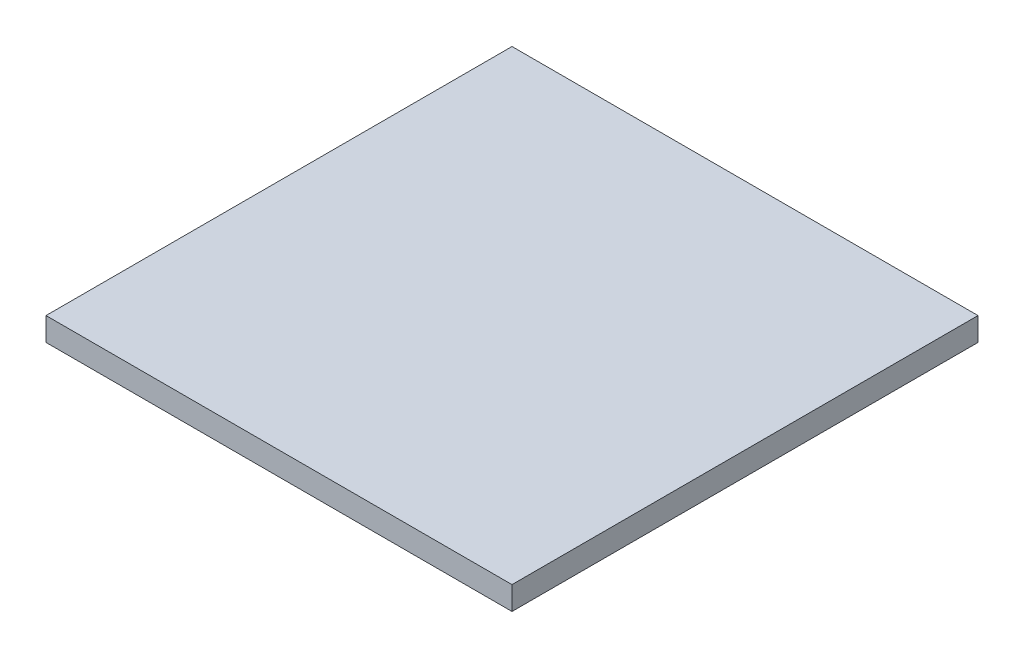
ISO-10303-21;
HEADER;
FILE_DESCRIPTION(('STEP AP214'),'2;1');
FILE_NAME('part.step','',(''),(''),'','','');
FILE_SCHEMA(('AUTOMOTIVE_DESIGN { 1 0 10303 214 1 1 1 1 }'));
ENDSEC;
DATA;
#1=APPLICATION_CONTEXT('core data for automotive mechanical design processes');
#2=APPLICATION_PROTOCOL_DEFINITION('international standard','automotive_design',2000,#1);
#3=PRODUCT_CONTEXT('',#1,'mechanical');
#4=PRODUCT('Part','Part','',(#3));
#5=PRODUCT_RELATED_PRODUCT_CATEGORY('part','',(#4));
#6=PRODUCT_DEFINITION_FORMATION('','',#4);
#7=PRODUCT_DEFINITION_CONTEXT('part definition',#1,'design');
#8=PRODUCT_DEFINITION('design','',#6,#7);
#9=PRODUCT_DEFINITION_SHAPE('','',#8);
#10=(LENGTH_UNIT() NAMED_UNIT(*) SI_UNIT(.MILLI.,.METRE.));
#11=(NAMED_UNIT(*) PLANE_ANGLE_UNIT() SI_UNIT($,.RADIAN.));
#12=(NAMED_UNIT(*) SI_UNIT($,.STERADIAN.) SOLID_ANGLE_UNIT());
#13=UNCERTAINTY_MEASURE_WITH_UNIT(LENGTH_MEASURE(1.E-05),#10,'distance_accuracy_value','');
#14=(GEOMETRIC_REPRESENTATION_CONTEXT(3) GLOBAL_UNCERTAINTY_ASSIGNED_CONTEXT((#13)) GLOBAL_UNIT_ASSIGNED_CONTEXT((#10,
#11,#12)) REPRESENTATION_CONTEXT('',''));
#15=CARTESIAN_POINT('',(0.,0.,0.));
#16=DIRECTION('',(0.,0.,1.));
#17=DIRECTION('',(1.,0.,0.));
#18=AXIS2_PLACEMENT_3D('',#15,#16,#17);
#19=CARTESIAN_POINT('',(50.,2.5,-50.));
#20=DIRECTION('',(-1.,0.,0.));
#21=DIRECTION('',(0.,0.,1.));
#22=AXIS2_PLACEMENT_3D('',#19,#20,#21);
#23=PLANE('',#22);
#24=DIRECTION('',(0.,0.,-1.));
#25=VECTOR('',#24,1.);
#26=CARTESIAN_POINT('',(50.,-2.5,-50.));
#27=LINE('',#26,#25);
#28=CARTESIAN_POINT('',(50.,-2.5,50.));
#29=VERTEX_POINT('',#28);
#30=CARTESIAN_POINT('',(50.,-2.5,-50.));
#31=VERTEX_POINT('',#30);
#32=EDGE_CURVE('E107',#29,#31,#27,.T.);
#33=ORIENTED_EDGE('',*,*,#32,.T.);
#34=DIRECTION('',(0.,-1.,0.));
#35=VECTOR('',#34,1.);
#36=CARTESIAN_POINT('',(50.,2.5,-50.));
#37=LINE('',#36,#35);
#38=CARTESIAN_POINT('',(50.,2.5,-50.));
#39=VERTEX_POINT('',#38);
#40=EDGE_CURVE('E11',#39,#31,#37,.T.);
#41=ORIENTED_EDGE('',*,*,#40,.F.);
#42=DIRECTION('',(0.,0.,-1.));
#43=VECTOR('',#42,1.);
#44=CARTESIAN_POINT('',(50.,2.5,-50.));
#45=LINE('',#44,#43);
#46=CARTESIAN_POINT('',(50.,2.5,50.));
#47=VERTEX_POINT('',#46);
#48=EDGE_CURVE('E91',#47,#39,#45,.T.);
#49=ORIENTED_EDGE('',*,*,#48,.F.);
#50=DIRECTION('',(0.,-1.,0.));
#51=VECTOR('',#50,1.);
#52=CARTESIAN_POINT('',(50.,2.5,50.));
#53=LINE('',#52,#51);
#54=EDGE_CURVE('E103',#47,#29,#53,.T.);
#55=ORIENTED_EDGE('',*,*,#54,.T.);
#56=EDGE_LOOP('',(#33,#41,#49,#55));
#57=FACE_BOUND('',#56,.T.);
#58=ADVANCED_FACE('F39',(#57),#23,.F.);
#59=CARTESIAN_POINT('',(-50.,2.5,-50.));
#60=DIRECTION('',(0.,0.,1.));
#61=DIRECTION('',(1.,0.,0.));
#62=AXIS2_PLACEMENT_3D('',#59,#60,#61);
#63=PLANE('',#62);
#64=DIRECTION('',(-1.,0.,0.));
#65=VECTOR('',#64,1.);
#66=CARTESIAN_POINT('',(-50.,-2.5,-50.));
#67=LINE('',#66,#65);
#68=CARTESIAN_POINT('',(-50.,-2.5,-50.));
#69=VERTEX_POINT('',#68);
#70=EDGE_CURVE('E96',#31,#69,#67,.T.);
#71=ORIENTED_EDGE('',*,*,#70,.T.);
#72=DIRECTION('',(0.,-1.,0.));
#73=VECTOR('',#72,1.);
#74=CARTESIAN_POINT('',(-50.,2.5,-50.));
#75=LINE('',#74,#73);
#76=CARTESIAN_POINT('',(-50.,2.5,-50.));
#77=VERTEX_POINT('',#76);
#78=EDGE_CURVE('E48',#77,#69,#75,.T.);
#79=ORIENTED_EDGE('',*,*,#78,.F.);
#80=DIRECTION('',(-1.,0.,0.));
#81=VECTOR('',#80,1.);
#82=CARTESIAN_POINT('',(-50.,2.5,-50.));
#83=LINE('',#82,#81);
#84=EDGE_CURVE('E86',#39,#77,#83,.T.);
#85=ORIENTED_EDGE('',*,*,#84,.F.);
#86=ORIENTED_EDGE('',*,*,#40,.T.);
#87=EDGE_LOOP('',(#71,#79,#85,#86));
#88=FACE_BOUND('',#87,.T.);
#89=ADVANCED_FACE('F95',(#88),#63,.F.);
#90=CARTESIAN_POINT('',(-50.,2.5,-50.));
#91=DIRECTION('',(1.,0.,0.));
#92=DIRECTION('',(0.,0.,-1.));
#93=AXIS2_PLACEMENT_3D('',#90,#91,#92);
#94=PLANE('',#93);
#95=DIRECTION('',(0.,0.,1.));
#96=VECTOR('',#95,1.);
#97=CARTESIAN_POINT('',(-50.,-2.5,-50.));
#98=LINE('',#97,#96);
#99=CARTESIAN_POINT('',(-50.,-2.5,50.));
#100=VERTEX_POINT('',#99);
#101=EDGE_CURVE('E73',#69,#100,#98,.T.);
#102=ORIENTED_EDGE('',*,*,#101,.T.);
#103=DIRECTION('',(0.,-1.,0.));
#104=VECTOR('',#103,1.);
#105=CARTESIAN_POINT('',(-50.,2.5,50.));
#106=LINE('',#105,#104);
#107=CARTESIAN_POINT('',(-50.,2.5,50.));
#108=VERTEX_POINT('',#107);
#109=EDGE_CURVE('E98',#108,#100,#106,.T.);
#110=ORIENTED_EDGE('',*,*,#109,.F.);
#111=DIRECTION('',(0.,0.,1.));
#112=VECTOR('',#111,1.);
#113=CARTESIAN_POINT('',(-50.,2.5,-50.));
#114=LINE('',#113,#112);
#115=EDGE_CURVE('E89',#77,#108,#114,.T.);
#116=ORIENTED_EDGE('',*,*,#115,.F.);
#117=ORIENTED_EDGE('',*,*,#78,.T.);
#118=EDGE_LOOP('',(#102,#110,#116,#117));
#119=FACE_BOUND('',#118,.T.);
#120=ADVANCED_FACE('F99',(#119),#94,.F.);
#121=CARTESIAN_POINT('',(-50.,2.5,50.));
#122=DIRECTION('',(0.,0.,-1.));
#123=DIRECTION('',(-1.,0.,0.));
#124=AXIS2_PLACEMENT_3D('',#121,#122,#123);
#125=PLANE('',#124);
#126=DIRECTION('',(1.,0.,0.));
#127=VECTOR('',#126,1.);
#128=CARTESIAN_POINT('',(-50.,-2.5,50.));
#129=LINE('',#128,#127);
#130=EDGE_CURVE('E79',#100,#29,#129,.T.);
#131=ORIENTED_EDGE('',*,*,#130,.T.);
#132=ORIENTED_EDGE('',*,*,#54,.F.);
#133=DIRECTION('',(1.,0.,0.));
#134=VECTOR('',#133,1.);
#135=CARTESIAN_POINT('',(-50.,2.5,50.));
#136=LINE('',#135,#134);
#137=EDGE_CURVE('E56',#108,#47,#136,.T.);
#138=ORIENTED_EDGE('',*,*,#137,.F.);
#139=ORIENTED_EDGE('',*,*,#109,.T.);
#140=EDGE_LOOP('',(#131,#132,#138,#139));
#141=FACE_BOUND('',#140,.T.);
#142=ADVANCED_FACE('F120',(#141),#125,.F.);
#143=CARTESIAN_POINT('',(0.,2.5,0.));
#144=DIRECTION('',(0.,1.,0.));
#145=DIRECTION('',(0.,0.,1.));
#146=AXIS2_PLACEMENT_3D('',#143,#144,#145);
#147=PLANE('',#146);
#148=ORIENTED_EDGE('',*,*,#48,.T.);
#149=ORIENTED_EDGE('',*,*,#84,.T.);
#150=ORIENTED_EDGE('',*,*,#115,.T.);
#151=ORIENTED_EDGE('',*,*,#137,.T.);
#152=EDGE_LOOP('',(#148,#149,#150,#151));
#153=FACE_BOUND('',#152,.T.);
#154=ADVANCED_FACE('F87',(#153),#147,.T.);
#155=CARTESIAN_POINT('',(0.,-2.5,0.));
#156=DIRECTION('',(0.,1.,0.));
#157=DIRECTION('',(0.,0.,1.));
#158=AXIS2_PLACEMENT_3D('',#155,#156,#157);
#159=PLANE('',#158);
#160=ORIENTED_EDGE('',*,*,#32,.F.);
#161=ORIENTED_EDGE('',*,*,#130,.F.);
#162=ORIENTED_EDGE('',*,*,#101,.F.);
#163=ORIENTED_EDGE('',*,*,#70,.F.);
#164=EDGE_LOOP('',(#160,#161,#162,#163));
#165=FACE_BOUND('',#164,.T.);
#166=ADVANCED_FACE('F123',(#165),#159,.F.);
#167=CLOSED_SHELL('',(#58,#89,#120,#142,#154,#166));
#168=MANIFOLD_SOLID_BREP('B2',#167);
#169=ADVANCED_BREP_SHAPE_REPRESENTATION('',(#18,#168),#14);
#170=SHAPE_DEFINITION_REPRESENTATION(#9,#169);
ENDSEC;
END-ISO-10303-21;
